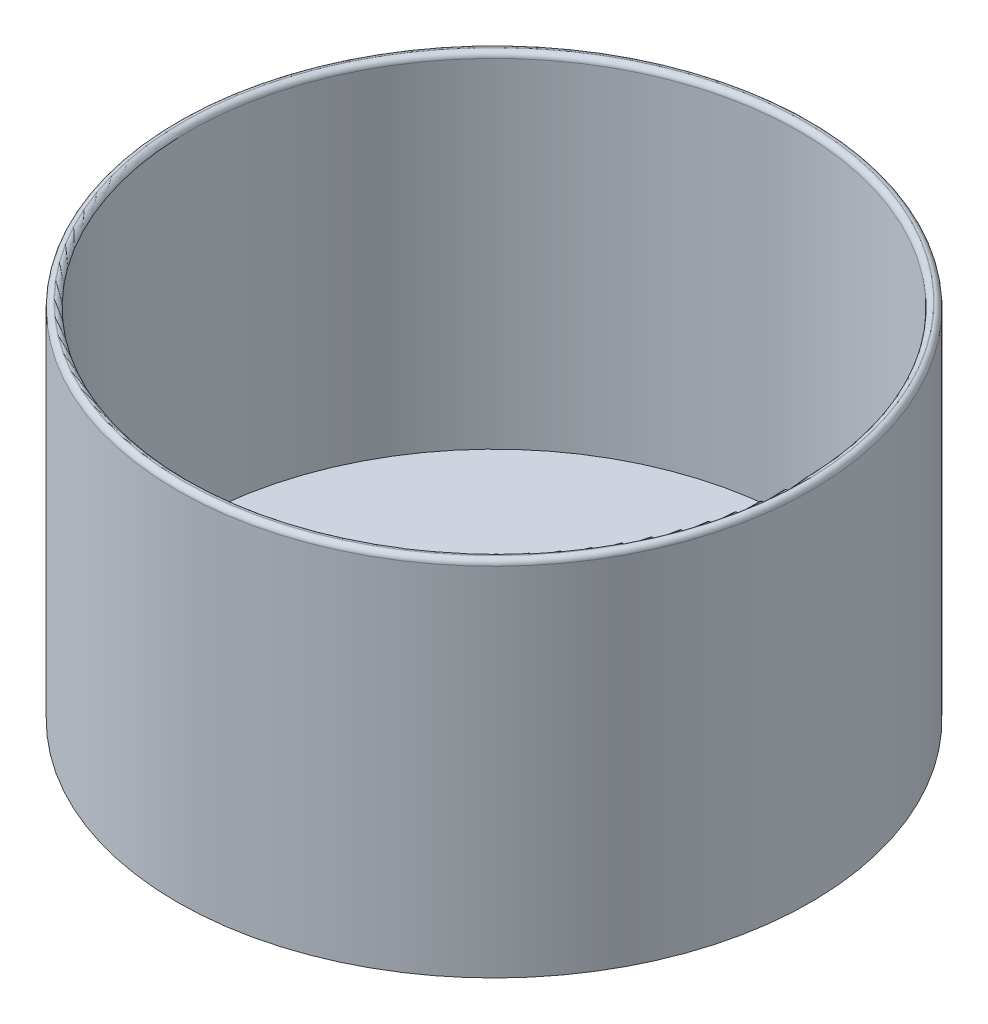
ISO-10303-21;
HEADER;
FILE_DESCRIPTION(('STEP AP214'),'2;1');
FILE_NAME('part.step','',(''),(''),'','','');
FILE_SCHEMA(('AUTOMOTIVE_DESIGN { 1 0 10303 214 1 1 1 1 }'));
ENDSEC;
DATA;
#1=APPLICATION_CONTEXT('core data for automotive mechanical design processes');
#2=APPLICATION_PROTOCOL_DEFINITION('international standard','automotive_design',2000,#1);
#3=PRODUCT_CONTEXT('',#1,'mechanical');
#4=PRODUCT('Part','Part','',(#3));
#5=PRODUCT_RELATED_PRODUCT_CATEGORY('part','',(#4));
#6=PRODUCT_DEFINITION_FORMATION('','',#4);
#7=PRODUCT_DEFINITION_CONTEXT('part definition',#1,'design');
#8=PRODUCT_DEFINITION('design','',#6,#7);
#9=PRODUCT_DEFINITION_SHAPE('','',#8);
#10=(LENGTH_UNIT() NAMED_UNIT(*) SI_UNIT(.MILLI.,.METRE.));
#11=(NAMED_UNIT(*) PLANE_ANGLE_UNIT() SI_UNIT($,.RADIAN.));
#12=(NAMED_UNIT(*) SI_UNIT($,.STERADIAN.) SOLID_ANGLE_UNIT());
#13=UNCERTAINTY_MEASURE_WITH_UNIT(LENGTH_MEASURE(1.E-05),#10,'distance_accuracy_value','');
#14=(GEOMETRIC_REPRESENTATION_CONTEXT(3) GLOBAL_UNCERTAINTY_ASSIGNED_CONTEXT((#13)) GLOBAL_UNIT_ASSIGNED_CONTEXT((#10,
#11,#12)) REPRESENTATION_CONTEXT('',''));
#15=CARTESIAN_POINT('',(0.,0.,0.));
#16=DIRECTION('',(0.,0.,1.));
#17=DIRECTION('',(1.,0.,0.));
#18=AXIS2_PLACEMENT_3D('',#15,#16,#17);
#19=CARTESIAN_POINT('',(6.35,12.7,-6.35));
#20=DIRECTION('',(0.,1.,0.));
#21=DIRECTION('',(0.,0.,1.));
#22=AXIS2_PLACEMENT_3D('',#19,#20,#21);
#23=PLANE('',#22);
#24=CARTESIAN_POINT('',(6.35,12.7,-6.35));
#25=DIRECTION('',(0.,1.,0.));
#26=DIRECTION('',(0.,0.,1.));
#27=AXIS2_PLACEMENT_3D('',#24,#25,#26);
#28=CIRCLE('',#27,88.9);
#29=CARTESIAN_POINT('',(6.35,12.7,82.55));
#30=VERTEX_POINT('',#29);
#31=EDGE_CURVE('E60',#30,#30,#28,.T.);
#32=ORIENTED_EDGE('',*,*,#31,.F.);
#33=EDGE_LOOP('',(#32));
#34=FACE_BOUND('',#33,.T.);
#35=ADVANCED_FACE('F40',(#34),#23,.F.);
#36=CARTESIAN_POINT('',(6.35,114.3,-6.35));
#37=DIRECTION('',(0.,-1.,0.));
#38=DIRECTION('',(0.,0.,-1.));
#39=AXIS2_PLACEMENT_3D('',#36,#37,#38);
#40=CYLINDRICAL_SURFACE('',#39,88.9);
#41=CARTESIAN_POINT('',(6.35,112.776,-6.35));
#42=DIRECTION('',(0.,1.,0.));
#43=DIRECTION('',(0.,0.,1.));
#44=AXIS2_PLACEMENT_3D('',#41,#42,#43);
#45=CIRCLE('',#44,88.9);
#46=CARTESIAN_POINT('',(6.35,112.776,82.55));
#47=VERTEX_POINT('',#46);
#48=EDGE_CURVE('E42',#47,#47,#45,.F.);
#49=ORIENTED_EDGE('',*,*,#48,.T.);
#50=EDGE_LOOP('',(#49));
#51=FACE_BOUND('',#50,.T.);
#52=ORIENTED_EDGE('',*,*,#31,.T.);
#53=EDGE_LOOP('',(#52));
#54=FACE_BOUND('',#53,.T.);
#55=ADVANCED_FACE('F77',(#51,#54),#40,.T.);
#56=CARTESIAN_POINT('',(6.35,114.3,-6.35));
#57=DIRECTION('',(0.,1.,0.));
#58=DIRECTION('',(0.,0.,1.));
#59=AXIS2_PLACEMENT_3D('',#56,#57,#58);
#60=PLANE('',#59);
#61=CARTESIAN_POINT('',(6.35,114.3,-6.35));
#62=DIRECTION('',(0.,1.,0.));
#63=DIRECTION('',(0.,0.,1.));
#64=AXIS2_PLACEMENT_3D('',#61,#62,#63);
#65=CIRCLE('',#64,87.376);
#66=CARTESIAN_POINT('',(6.35,114.3,81.026));
#67=VERTEX_POINT('',#66);
#68=EDGE_CURVE('E48',#67,#67,#65,.T.);
#69=ORIENTED_EDGE('',*,*,#68,.T.);
#70=EDGE_LOOP('',(#69));
#71=FACE_BOUND('',#70,.T.);
#72=CARTESIAN_POINT('',(6.35,114.3,-6.35));
#73=DIRECTION('',(0.,1.,0.));
#74=DIRECTION('',(0.,0.,1.));
#75=AXIS2_PLACEMENT_3D('',#72,#73,#74);
#76=CIRCLE('',#75,87.249);
#77=CARTESIAN_POINT('',(6.35,114.3,80.899));
#78=VERTEX_POINT('',#77);
#79=EDGE_CURVE('E55',#78,#78,#76,.F.);
#80=ORIENTED_EDGE('',*,*,#79,.T.);
#81=EDGE_LOOP('',(#80));
#82=FACE_BOUND('',#81,.T.);
#83=ADVANCED_FACE('F67',(#71,#82),#60,.T.);
#84=CARTESIAN_POINT('',(6.35,17.78,-6.35));
#85=DIRECTION('',(0.,1.,0.));
#86=DIRECTION('',(0.,0.,1.));
#87=AXIS2_PLACEMENT_3D('',#84,#85,#86);
#88=CYLINDRICAL_SURFACE('',#87,85.725);
#89=CARTESIAN_POINT('',(6.35,112.776,-6.35));
#90=DIRECTION('',(0.,1.,0.));
#91=DIRECTION('',(0.,0.,1.));
#92=AXIS2_PLACEMENT_3D('',#89,#90,#91);
#93=CIRCLE('',#92,85.725);
#94=CARTESIAN_POINT('',(6.35,112.776,79.375));
#95=VERTEX_POINT('',#94);
#96=EDGE_CURVE('E10',#95,#95,#93,.T.);
#97=CARTESIAN_POINT('',(6.35,17.78,-6.35));
#98=DIRECTION('',(0.,1.,0.));
#99=DIRECTION('',(0.,0.,1.));
#100=AXIS2_PLACEMENT_3D('',#97,#98,#99);
#101=CIRCLE('',#100,85.725);
#102=CARTESIAN_POINT('',(6.35,17.78,79.375));
#103=VERTEX_POINT('',#102);
#104=EDGE_CURVE('E58',#103,#103,#101,.T.);
#105=CARTESIAN_POINT('',(6.35,112.776,79.375));
#106=CARTESIAN_POINT('',(6.35,111.786458333333,79.375));
#107=CARTESIAN_POINT('',(6.35,110.796916666667,79.375));
#108=CARTESIAN_POINT('',(6.35,108.817833333333,79.375));
#109=CARTESIAN_POINT('',(6.35,107.828291666667,79.375));
#110=CARTESIAN_POINT('',(6.35,105.849208333333,79.375));
#111=CARTESIAN_POINT('',(6.35,104.859666666667,79.375));
#112=CARTESIAN_POINT('',(6.35,102.880583333333,79.375));
#113=CARTESIAN_POINT('',(6.35,101.891041666667,79.375));
#114=CARTESIAN_POINT('',(6.35,99.9119583333333,79.375));
#115=CARTESIAN_POINT('',(6.35,98.9224166666666,79.375));
#116=CARTESIAN_POINT('',(6.35,96.9433333333333,79.375));
#117=CARTESIAN_POINT('',(6.35,95.9537916666666,79.375));
#118=CARTESIAN_POINT('',(6.35,93.9747083333333,79.375));
#119=CARTESIAN_POINT('',(6.35,92.9851666666666,79.375));
#120=CARTESIAN_POINT('',(6.35,91.0060833333333,79.375));
#121=CARTESIAN_POINT('',(6.35,90.0165416666667,79.375));
#122=CARTESIAN_POINT('',(6.35,88.0374583333333,79.375));
#123=CARTESIAN_POINT('',(6.35,87.0479166666667,79.375));
#124=CARTESIAN_POINT('',(6.35,85.0688333333333,79.375));
#125=CARTESIAN_POINT('',(6.35,84.0792916666666,79.375));
#126=CARTESIAN_POINT('',(6.35,82.1002083333333,79.375));
#127=CARTESIAN_POINT('',(6.35,81.1106666666666,79.375));
#128=CARTESIAN_POINT('',(6.35,79.1315833333333,79.375));
#129=CARTESIAN_POINT('',(6.35,78.1420416666666,79.375));
#130=CARTESIAN_POINT('',(6.35,76.1629583333333,79.375));
#131=CARTESIAN_POINT('',(6.35,75.1734166666667,79.375));
#132=CARTESIAN_POINT('',(6.35,73.1943333333333,79.375));
#133=CARTESIAN_POINT('',(6.35,72.2047916666667,79.375));
#134=CARTESIAN_POINT('',(6.35,70.2257083333333,79.375));
#135=CARTESIAN_POINT('',(6.35,69.2361666666667,79.375));
#136=CARTESIAN_POINT('',(6.35,67.2570833333333,79.375));
#137=CARTESIAN_POINT('',(6.35,66.2675416666667,79.375));
#138=CARTESIAN_POINT('',(6.35,64.2884583333333,79.375));
#139=CARTESIAN_POINT('',(6.35,63.2989166666667,79.375));
#140=CARTESIAN_POINT('',(6.35,61.3198333333333,79.375));
#141=CARTESIAN_POINT('',(6.35,60.3302916666667,79.375));
#142=CARTESIAN_POINT('',(6.35,58.3512083333333,79.375));
#143=CARTESIAN_POINT('',(6.35,57.3616666666667,79.375));
#144=CARTESIAN_POINT('',(6.35,55.3825833333333,79.375));
#145=CARTESIAN_POINT('',(6.35,54.3930416666667,79.375));
#146=CARTESIAN_POINT('',(6.35,52.4139583333333,79.375));
#147=CARTESIAN_POINT('',(6.35,51.4244166666667,79.375));
#148=CARTESIAN_POINT('',(6.35,49.4453333333333,79.375));
#149=CARTESIAN_POINT('',(6.35,48.4557916666667,79.375));
#150=CARTESIAN_POINT('',(6.35,46.4767083333333,79.375));
#151=CARTESIAN_POINT('',(6.35,45.4871666666667,79.375));
#152=CARTESIAN_POINT('',(6.35,43.5080833333333,79.375));
#153=CARTESIAN_POINT('',(6.35,42.5185416666667,79.375));
#154=CARTESIAN_POINT('',(6.35,40.5394583333333,79.375));
#155=CARTESIAN_POINT('',(6.35,39.5499166666667,79.375));
#156=CARTESIAN_POINT('',(6.35,37.5708333333333,79.375));
#157=CARTESIAN_POINT('',(6.35,36.5812916666667,79.375));
#158=CARTESIAN_POINT('',(6.35,34.6022083333333,79.375));
#159=CARTESIAN_POINT('',(6.35,33.6126666666667,79.375));
#160=CARTESIAN_POINT('',(6.35,31.6335833333333,79.375));
#161=CARTESIAN_POINT('',(6.35,30.6440416666667,79.375));
#162=CARTESIAN_POINT('',(6.35,28.6649583333333,79.375));
#163=CARTESIAN_POINT('',(6.35,27.6754166666667,79.375));
#164=CARTESIAN_POINT('',(6.35,25.6963333333333,79.375));
#165=CARTESIAN_POINT('',(6.35,24.7067916666667,79.375));
#166=CARTESIAN_POINT('',(6.35,22.7277083333333,79.375));
#167=CARTESIAN_POINT('',(6.35,21.7381666666667,79.375));
#168=CARTESIAN_POINT('',(6.35,19.7590833333333,79.375));
#169=CARTESIAN_POINT('',(6.35,18.7695416666667,79.375));
#170=CARTESIAN_POINT('',(6.35,17.78,79.375));
#171=B_SPLINE_CURVE_WITH_KNOTS('',3,(#105,#106,#107,#108,#109,#110,#111,#112,#113,#114,#115,
#116,#117,#118,#119,#120,#121,#122,#123,#124,#125,#126,#127,#128,#129,#130,#131,#132,#133,#134,
#135,#136,#137,#138,#139,#140,#141,#142,#143,#144,#145,#146,#147,#148,#149,#150,#151,#152,#153,
#154,#155,#156,#157,#158,#159,#160,#161,#162,#163,#164,#165,#166,#167,#168,#169,#170),
.UNSPECIFIED.,.F.,.F.,(4,2,2,2,2,2,2,2,2,2,2,2,2,2,2,2,2,2,2,2,2,2,2,2,2,2,2,2,2,2,2,2,4),(0.,
2.968625,5.93725000000001,8.90587500000001,11.8745,14.843125,17.81175,20.780375,23.749,
26.717625,29.68625,32.654875,35.6235,38.592125,41.56075,44.529375,47.498,50.466625,53.43525,
56.403875,59.3725,62.341125,65.30975,68.278375,71.247,74.215625,77.18425,80.152875,83.1215,
86.090125,89.05875,92.027375,94.996),.UNSPECIFIED.);
#172=EDGE_CURVE('BSEAM68',#95,#103,#171,.T.);
#173=ORIENTED_EDGE('',*,*,#96,.T.);
#174=ORIENTED_EDGE('',*,*,#104,.F.);
#175=ORIENTED_EDGE('',*,*,#172,.T.);
#176=ORIENTED_EDGE('',*,*,#172,.F.);
#177=EDGE_LOOP('',(#173,#175,#174,#176));
#178=FACE_BOUND('',#177,.T.);
#179=ADVANCED_FACE('F68',(#178),#88,.F.);
#180=CARTESIAN_POINT('',(6.35,17.78,-6.35));
#181=DIRECTION('',(0.,1.,0.));
#182=DIRECTION('',(0.,0.,1.));
#183=AXIS2_PLACEMENT_3D('',#180,#181,#182);
#184=PLANE('',#183);
#185=ORIENTED_EDGE('',*,*,#104,.T.);
#186=EDGE_LOOP('',(#185));
#187=FACE_BOUND('',#186,.T.);
#188=ADVANCED_FACE('F63',(#187),#184,.T.);
#189=CARTESIAN_POINT('',(6.35,112.776,-6.35));
#190=DIRECTION('',(0.,1.,0.));
#191=DIRECTION('',(0.,0.,1.));
#192=AXIS2_PLACEMENT_3D('',#189,#190,#191);
#193=TOROIDAL_SURFACE('',#192,87.376,1.524);
#194=ORIENTED_EDGE('',*,*,#48,.F.);
#195=EDGE_LOOP('',(#194));
#196=FACE_BOUND('',#195,.T.);
#197=ORIENTED_EDGE('',*,*,#68,.F.);
#198=EDGE_LOOP('',(#197));
#199=FACE_BOUND('',#198,.T.);
#200=ADVANCED_FACE('F73',(#196,#199),#193,.T.);
#201=CARTESIAN_POINT('',(6.35,112.776,-6.35));
#202=DIRECTION('',(0.,1.,0.));
#203=DIRECTION('',(0.,0.,1.));
#204=AXIS2_PLACEMENT_3D('',#201,#202,#203);
#205=TOROIDAL_SURFACE('',#204,87.249,1.524);
#206=ORIENTED_EDGE('',*,*,#79,.F.);
#207=EDGE_LOOP('',(#206));
#208=FACE_BOUND('',#207,.T.);
#209=ORIENTED_EDGE('',*,*,#96,.F.);
#210=EDGE_LOOP('',(#209));
#211=FACE_BOUND('',#210,.T.);
#212=ADVANCED_FACE('F39',(#208,#211),#205,.T.);
#213=CLOSED_SHELL('',(#35,#55,#83,#179,#188,#200,#212));
#214=MANIFOLD_SOLID_BREP('B2',#213);
#215=ADVANCED_BREP_SHAPE_REPRESENTATION('',(#18,#214),#14);
#216=SHAPE_DEFINITION_REPRESENTATION(#9,#215);
ENDSEC;
END-ISO-10303-21;
